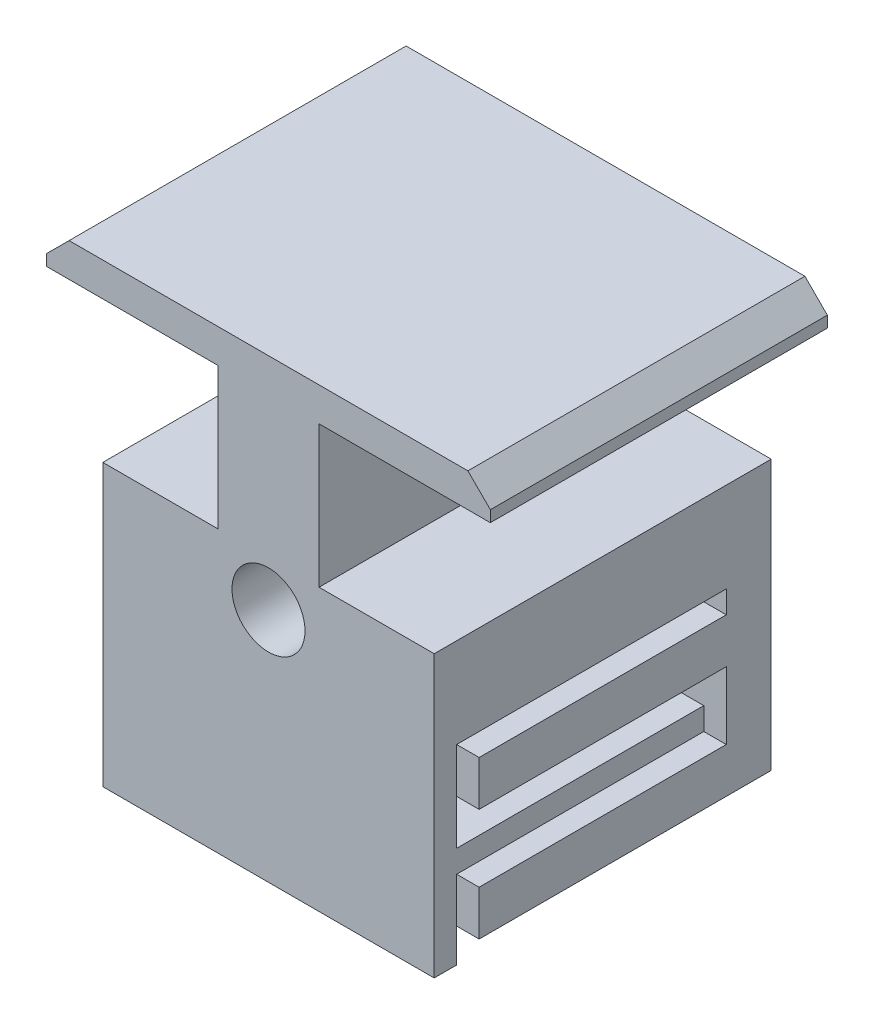
ISO-10303-21;
HEADER;
FILE_DESCRIPTION(('STEP AP214'),'2;1');
FILE_NAME('part.step','',(''),(''),'','','');
FILE_SCHEMA(('AUTOMOTIVE_DESIGN { 1 0 10303 214 1 1 1 1 }'));
ENDSEC;
DATA;
#1=APPLICATION_CONTEXT('core data for automotive mechanical design processes');
#2=APPLICATION_PROTOCOL_DEFINITION('international standard','automotive_design',2000,#1);
#3=PRODUCT_CONTEXT('',#1,'mechanical');
#4=PRODUCT('Part','Part','',(#3));
#5=PRODUCT_RELATED_PRODUCT_CATEGORY('part','',(#4));
#6=PRODUCT_DEFINITION_FORMATION('','',#4);
#7=PRODUCT_DEFINITION_CONTEXT('part definition',#1,'design');
#8=PRODUCT_DEFINITION('design','',#6,#7);
#9=PRODUCT_DEFINITION_SHAPE('','',#8);
#10=(LENGTH_UNIT() NAMED_UNIT(*) SI_UNIT(.MILLI.,.METRE.));
#11=(NAMED_UNIT(*) PLANE_ANGLE_UNIT() SI_UNIT($,.RADIAN.));
#12=(NAMED_UNIT(*) SI_UNIT($,.STERADIAN.) SOLID_ANGLE_UNIT());
#13=UNCERTAINTY_MEASURE_WITH_UNIT(LENGTH_MEASURE(1.E-05),#10,'distance_accuracy_value','');
#14=(GEOMETRIC_REPRESENTATION_CONTEXT(3) GLOBAL_UNCERTAINTY_ASSIGNED_CONTEXT((#13)) GLOBAL_UNIT_ASSIGNED_CONTEXT((#10,
#11,#12)) REPRESENTATION_CONTEXT('',''));
#15=CARTESIAN_POINT('',(0.,0.,0.));
#16=DIRECTION('',(0.,0.,1.));
#17=DIRECTION('',(1.,0.,0.));
#18=AXIS2_PLACEMENT_3D('',#15,#16,#17);
#19=CARTESIAN_POINT('',(19.25,-40.6,30.));
#20=DIRECTION('',(0.,1.,0.));
#21=DIRECTION('',(0.,0.,1.));
#22=AXIS2_PLACEMENT_3D('',#19,#20,#21);
#23=PLANE('',#22);
#24=DIRECTION('',(-1.,0.,0.));
#25=VECTOR('',#24,1.);
#26=CARTESIAN_POINT('',(19.25,-40.6,28.));
#27=LINE('',#26,#25);
#28=CARTESIAN_POINT('',(19.25,-40.6,28.));
#29=VERTEX_POINT('',#28);
#30=CARTESIAN_POINT('',(0.,-40.6,28.));
#31=VERTEX_POINT('',#30);
#32=EDGE_CURVE('E325',#29,#31,#27,.T.);
#33=ORIENTED_EDGE('',*,*,#32,.F.);
#34=DIRECTION('',(0.,0.,-1.));
#35=VECTOR('',#34,1.);
#36=CARTESIAN_POINT('',(19.25,-40.6,30.));
#37=LINE('',#36,#35);
#38=CARTESIAN_POINT('',(19.25,-40.6,30.));
#39=VERTEX_POINT('',#38);
#40=EDGE_CURVE('E394',#39,#29,#37,.T.);
#41=ORIENTED_EDGE('',*,*,#40,.F.);
#42=DIRECTION('',(1.,0.,0.));
#43=VECTOR('',#42,1.);
#44=CARTESIAN_POINT('',(19.25,-40.6,30.));
#45=LINE('',#44,#43);
#46=CARTESIAN_POINT('',(-10.25,-40.6,30.));
#47=VERTEX_POINT('',#46);
#48=EDGE_CURVE('E344',#47,#39,#45,.T.);
#49=ORIENTED_EDGE('',*,*,#48,.F.);
#50=DIRECTION('',(0.,0.,-1.));
#51=VECTOR('',#50,1.);
#52=CARTESIAN_POINT('',(-10.25,-40.6,30.));
#53=LINE('',#52,#51);
#54=CARTESIAN_POINT('',(-10.25,-40.6,0.));
#55=VERTEX_POINT('',#54);
#56=EDGE_CURVE('E397',#47,#55,#53,.T.);
#57=ORIENTED_EDGE('',*,*,#56,.T.);
#58=DIRECTION('',(1.,0.,0.));
#59=VECTOR('',#58,1.);
#60=CARTESIAN_POINT('',(19.25,-40.6,0.));
#61=LINE('',#60,#59);
#62=CARTESIAN_POINT('',(0.,-40.6,0.));
#63=VERTEX_POINT('',#62);
#64=EDGE_CURVE('E367',#55,#63,#61,.T.);
#65=ORIENTED_EDGE('',*,*,#64,.T.);
#66=DIRECTION('',(0.,0.,1.));
#67=VECTOR('',#66,1.);
#68=CARTESIAN_POINT('',(0.,-40.6,30.));
#69=LINE('',#68,#67);
#70=EDGE_CURVE('E286',#63,#31,#69,.T.);
#71=ORIENTED_EDGE('',*,*,#70,.T.);
#72=EDGE_LOOP('',(#33,#41,#49,#57,#65,#71));
#73=FACE_BOUND('',#72,.T.);
#74=ADVANCED_FACE('F33',(#73),#23,.F.);
#75=CARTESIAN_POINT('',(-15.25,0.,30.));
#76=DIRECTION('',(1.,0.,0.));
#77=DIRECTION('',(0.,0.,-1.));
#78=AXIS2_PLACEMENT_3D('',#75,#76,#77);
#79=PLANE('',#78);
#80=DIRECTION('',(0.,-1.,0.));
#81=VECTOR('',#80,1.);
#82=CARTESIAN_POINT('',(-15.25,0.,30.));
#83=LINE('',#82,#81);
#84=CARTESIAN_POINT('',(-15.25,-1.99999999999999,30.));
#85=VERTEX_POINT('',#84);
#86=CARTESIAN_POINT('',(-15.25,-3.,30.));
#87=VERTEX_POINT('',#86);
#88=EDGE_CURVE('E333',#85,#87,#83,.T.);
#89=ORIENTED_EDGE('',*,*,#88,.F.);
#90=DIRECTION('',(0.,0.,-1.));
#91=VECTOR('',#90,1.);
#92=CARTESIAN_POINT('',(-15.25,-1.99999999999999,30.));
#93=LINE('',#92,#91);
#94=CARTESIAN_POINT('',(-15.25,-1.99999999999999,0.));
#95=VERTEX_POINT('',#94);
#96=EDGE_CURVE('E11',#85,#95,#93,.T.);
#97=ORIENTED_EDGE('',*,*,#96,.T.);
#98=DIRECTION('',(0.,-1.,0.));
#99=VECTOR('',#98,1.);
#100=CARTESIAN_POINT('',(-15.25,0.,0.));
#101=LINE('',#100,#99);
#102=CARTESIAN_POINT('',(-15.25,-3.,0.));
#103=VERTEX_POINT('',#102);
#104=EDGE_CURVE('E357',#95,#103,#101,.T.);
#105=ORIENTED_EDGE('',*,*,#104,.T.);
#106=DIRECTION('',(0.,0.,-1.));
#107=VECTOR('',#106,1.);
#108=CARTESIAN_POINT('',(-15.25,-3.,30.));
#109=LINE('',#108,#107);
#110=EDGE_CURVE('E409',#87,#103,#109,.T.);
#111=ORIENTED_EDGE('',*,*,#110,.F.);
#112=EDGE_LOOP('',(#89,#97,#105,#111));
#113=FACE_BOUND('',#112,.T.);
#114=ADVANCED_FACE('F524',(#113),#79,.F.);
#115=CARTESIAN_POINT('',(-10.25,-3.,30.));
#116=DIRECTION('',(0.,1.,0.));
#117=DIRECTION('',(0.,0.,1.));
#118=AXIS2_PLACEMENT_3D('',#115,#116,#117);
#119=PLANE('',#118);
#120=DIRECTION('',(1.,0.,0.));
#121=VECTOR('',#120,1.);
#122=CARTESIAN_POINT('',(-10.25,-3.,0.));
#123=LINE('',#122,#121);
#124=CARTESIAN_POINT('',(0.,-3.,0.));
#125=VERTEX_POINT('',#124);
#126=EDGE_CURVE('E359',#103,#125,#123,.T.);
#127=ORIENTED_EDGE('',*,*,#126,.T.);
#128=DIRECTION('',(0.,0.,-1.));
#129=VECTOR('',#128,1.);
#130=CARTESIAN_POINT('',(0.,-3.,30.));
#131=LINE('',#130,#129);
#132=CARTESIAN_POINT('',(0.,-3.,30.));
#133=VERTEX_POINT('',#132);
#134=EDGE_CURVE('E406',#133,#125,#131,.T.);
#135=ORIENTED_EDGE('',*,*,#134,.F.);
#136=DIRECTION('',(1.,0.,0.));
#137=VECTOR('',#136,1.);
#138=CARTESIAN_POINT('',(-15.25,-3.,30.));
#139=LINE('',#138,#137);
#140=EDGE_CURVE('E336',#87,#133,#139,.T.);
#141=ORIENTED_EDGE('',*,*,#140,.F.);
#142=ORIENTED_EDGE('',*,*,#110,.T.);
#143=EDGE_LOOP('',(#127,#135,#141,#142));
#144=FACE_BOUND('',#143,.T.);
#145=ADVANCED_FACE('F520',(#144),#119,.F.);
#146=CARTESIAN_POINT('',(0.,-3.,30.));
#147=DIRECTION('',(1.,0.,0.));
#148=DIRECTION('',(0.,1.,0.));
#149=AXIS2_PLACEMENT_3D('',#146,#147,#148);
#150=PLANE('',#149);
#151=DIRECTION('',(0.,-1.,0.));
#152=VECTOR('',#151,1.);
#153=CARTESIAN_POINT('',(0.,-3.,0.));
#154=LINE('',#153,#152);
#155=CARTESIAN_POINT('',(0.,-15.6,0.));
#156=VERTEX_POINT('',#155);
#157=EDGE_CURVE('E361',#125,#156,#154,.T.);
#158=ORIENTED_EDGE('',*,*,#157,.T.);
#159=DIRECTION('',(0.,0.,-1.));
#160=VECTOR('',#159,1.);
#161=CARTESIAN_POINT('',(0.,-15.6,30.));
#162=LINE('',#161,#160);
#163=CARTESIAN_POINT('',(0.,-15.6,30.));
#164=VERTEX_POINT('',#163);
#165=EDGE_CURVE('E403',#164,#156,#162,.T.);
#166=ORIENTED_EDGE('',*,*,#165,.F.);
#167=DIRECTION('',(0.,-1.,0.));
#168=VECTOR('',#167,1.);
#169=CARTESIAN_POINT('',(0.,-3.,30.));
#170=LINE('',#169,#168);
#171=EDGE_CURVE('E338',#133,#164,#170,.T.);
#172=ORIENTED_EDGE('',*,*,#171,.F.);
#173=ORIENTED_EDGE('',*,*,#134,.T.);
#174=EDGE_LOOP('',(#158,#166,#172,#173));
#175=FACE_BOUND('',#174,.T.);
#176=ADVANCED_FACE('F516',(#175),#150,.F.);
#177=CARTESIAN_POINT('',(0.,-15.6,30.));
#178=DIRECTION('',(0.,-1.,0.));
#179=DIRECTION('',(1.,0.,0.));
#180=AXIS2_PLACEMENT_3D('',#177,#178,#179);
#181=PLANE('',#180);
#182=DIRECTION('',(-1.,0.,0.));
#183=VECTOR('',#182,1.);
#184=CARTESIAN_POINT('',(0.,-15.6,0.));
#185=LINE('',#184,#183);
#186=CARTESIAN_POINT('',(-10.25,-15.6,0.));
#187=VERTEX_POINT('',#186);
#188=EDGE_CURVE('E363',#156,#187,#185,.T.);
#189=ORIENTED_EDGE('',*,*,#188,.T.);
#190=DIRECTION('',(0.,0.,-1.));
#191=VECTOR('',#190,1.);
#192=CARTESIAN_POINT('',(-10.25,-15.6,30.));
#193=LINE('',#192,#191);
#194=CARTESIAN_POINT('',(-10.25,-15.6,30.));
#195=VERTEX_POINT('',#194);
#196=EDGE_CURVE('E400',#195,#187,#193,.T.);
#197=ORIENTED_EDGE('',*,*,#196,.F.);
#198=DIRECTION('',(-1.,0.,0.));
#199=VECTOR('',#198,1.);
#200=CARTESIAN_POINT('',(0.,-15.6,30.));
#201=LINE('',#200,#199);
#202=EDGE_CURVE('E340',#164,#195,#201,.T.);
#203=ORIENTED_EDGE('',*,*,#202,.F.);
#204=ORIENTED_EDGE('',*,*,#165,.T.);
#205=EDGE_LOOP('',(#189,#197,#203,#204));
#206=FACE_BOUND('',#205,.T.);
#207=ADVANCED_FACE('F511',(#206),#181,.F.);
#208=CARTESIAN_POINT('',(-10.25,-15.6,30.));
#209=DIRECTION('',(1.,0.,0.));
#210=DIRECTION('',(0.,1.,0.));
#211=AXIS2_PLACEMENT_3D('',#208,#209,#210);
#212=PLANE('',#211);
#213=DIRECTION('',(0.,-1.,0.));
#214=VECTOR('',#213,1.);
#215=CARTESIAN_POINT('',(-10.25,-15.6,0.));
#216=LINE('',#215,#214);
#217=EDGE_CURVE('E365',#187,#55,#216,.T.);
#218=ORIENTED_EDGE('',*,*,#217,.T.);
#219=ORIENTED_EDGE('',*,*,#56,.F.);
#220=DIRECTION('',(0.,-1.,0.));
#221=VECTOR('',#220,1.);
#222=CARTESIAN_POINT('',(-10.25,-15.6,30.));
#223=LINE('',#222,#221);
#224=EDGE_CURVE('E342',#195,#47,#223,.T.);
#225=ORIENTED_EDGE('',*,*,#224,.F.);
#226=ORIENTED_EDGE('',*,*,#196,.T.);
#227=EDGE_LOOP('',(#218,#219,#225,#226));
#228=FACE_BOUND('',#227,.T.);
#229=ADVANCED_FACE('F505',(#228),#212,.F.);
#230=CARTESIAN_POINT('',(19.25,-15.6,30.));
#231=DIRECTION('',(-1.,0.,0.));
#232=DIRECTION('',(0.,-1.,0.));
#233=AXIS2_PLACEMENT_3D('',#230,#231,#232);
#234=PLANE('',#233);
#235=DIRECTION('',(0.,-1.,0.));
#236=VECTOR('',#235,1.);
#237=CARTESIAN_POINT('',(19.25,-15.6,26.));
#238=LINE('',#237,#236);
#239=CARTESIAN_POINT('',(19.25,-35.6,26.));
#240=VERTEX_POINT('',#239);
#241=CARTESIAN_POINT('',(19.25,-39.6,26.));
#242=VERTEX_POINT('',#241);
#243=EDGE_CURVE('E441',#240,#242,#238,.T.);
#244=ORIENTED_EDGE('',*,*,#243,.T.);
#245=DIRECTION('',(0.,0.,-1.));
#246=VECTOR('',#245,1.);
#247=CARTESIAN_POINT('',(19.25,-39.6,30.));
#248=LINE('',#247,#246);
#249=CARTESIAN_POINT('',(19.25,-39.6,0.));
#250=VERTEX_POINT('',#249);
#251=EDGE_CURVE('E322',#242,#250,#248,.T.);
#252=ORIENTED_EDGE('',*,*,#251,.T.);
#253=DIRECTION('',(0.,1.,0.));
#254=VECTOR('',#253,1.);
#255=CARTESIAN_POINT('',(19.25,-15.6,0.));
#256=LINE('',#255,#254);
#257=CARTESIAN_POINT('',(19.25,-15.6,0.));
#258=VERTEX_POINT('',#257);
#259=EDGE_CURVE('E370',#250,#258,#256,.T.);
#260=ORIENTED_EDGE('',*,*,#259,.T.);
#261=DIRECTION('',(0.,0.,-1.));
#262=VECTOR('',#261,1.);
#263=CARTESIAN_POINT('',(19.25,-15.6,30.));
#264=LINE('',#263,#262);
#265=CARTESIAN_POINT('',(19.25,-15.6,30.));
#266=VERTEX_POINT('',#265);
#267=EDGE_CURVE('E391',#266,#258,#264,.T.);
#268=ORIENTED_EDGE('',*,*,#267,.F.);
#269=DIRECTION('',(0.,1.,0.));
#270=VECTOR('',#269,1.);
#271=CARTESIAN_POINT('',(19.25,-15.6,30.));
#272=LINE('',#271,#270);
#273=EDGE_CURVE('E346',#39,#266,#272,.T.);
#274=ORIENTED_EDGE('',*,*,#273,.F.);
#275=ORIENTED_EDGE('',*,*,#40,.T.);
#276=DIRECTION('',(0.,-1.,0.));
#277=VECTOR('',#276,1.);
#278=CARTESIAN_POINT('',(19.25,-15.6,28.));
#279=LINE('',#278,#277);
#280=CARTESIAN_POINT('',(19.25,-33.6,28.));
#281=VERTEX_POINT('',#280);
#282=EDGE_CURVE('E426',#281,#29,#279,.T.);
#283=ORIENTED_EDGE('',*,*,#282,.F.);
#284=DIRECTION('',(0.,0.,1.));
#285=VECTOR('',#284,1.);
#286=CARTESIAN_POINT('',(19.25,-33.6,30.));
#287=LINE('',#286,#285);
#288=CARTESIAN_POINT('',(19.25,-33.6,6.));
#289=VERTEX_POINT('',#288);
#290=EDGE_CURVE('E424',#289,#281,#287,.T.);
#291=ORIENTED_EDGE('',*,*,#290,.F.);
#292=DIRECTION('',(0.,-1.,0.));
#293=VECTOR('',#292,1.);
#294=CARTESIAN_POINT('',(19.25,-15.6,6.));
#295=LINE('',#294,#293);
#296=CARTESIAN_POINT('',(19.25,-31.6,6.));
#297=VERTEX_POINT('',#296);
#298=EDGE_CURVE('E422',#297,#289,#295,.T.);
#299=ORIENTED_EDGE('',*,*,#298,.F.);
#300=DIRECTION('',(0.,0.,-1.));
#301=VECTOR('',#300,1.);
#302=CARTESIAN_POINT('',(19.25,-31.6,30.));
#303=LINE('',#302,#301);
#304=CARTESIAN_POINT('',(19.25,-31.6,28.));
#305=VERTEX_POINT('',#304);
#306=EDGE_CURVE('E420',#305,#297,#303,.T.);
#307=ORIENTED_EDGE('',*,*,#306,.F.);
#308=DIRECTION('',(0.,-1.,0.));
#309=VECTOR('',#308,1.);
#310=CARTESIAN_POINT('',(19.25,-15.6,28.));
#311=LINE('',#310,#309);
#312=CARTESIAN_POINT('',(19.25,-23.6,28.));
#313=VERTEX_POINT('',#312);
#314=EDGE_CURVE('E418',#313,#305,#311,.T.);
#315=ORIENTED_EDGE('',*,*,#314,.F.);
#316=DIRECTION('',(0.,0.,1.));
#317=VECTOR('',#316,1.);
#318=CARTESIAN_POINT('',(19.25,-23.6,30.));
#319=LINE('',#318,#317);
#320=CARTESIAN_POINT('',(19.25,-23.6,4.));
#321=VERTEX_POINT('',#320);
#322=EDGE_CURVE('E416',#321,#313,#319,.T.);
#323=ORIENTED_EDGE('',*,*,#322,.F.);
#324=DIRECTION('',(0.,1.,0.));
#325=VECTOR('',#324,1.);
#326=CARTESIAN_POINT('',(19.25,-15.6,4.));
#327=LINE('',#326,#325);
#328=CARTESIAN_POINT('',(19.25,-25.6,4.));
#329=VERTEX_POINT('',#328);
#330=EDGE_CURVE('E412',#329,#321,#327,.T.);
#331=ORIENTED_EDGE('',*,*,#330,.F.);
#332=DIRECTION('',(0.,0.,1.));
#333=VECTOR('',#332,1.);
#334=CARTESIAN_POINT('',(19.25,-25.6,30.));
#335=LINE('',#334,#333);
#336=CARTESIAN_POINT('',(19.25,-25.6,26.));
#337=VERTEX_POINT('',#336);
#338=EDGE_CURVE('E247',#329,#337,#335,.T.);
#339=ORIENTED_EDGE('',*,*,#338,.T.);
#340=DIRECTION('',(0.,-1.,0.));
#341=VECTOR('',#340,1.);
#342=CARTESIAN_POINT('',(19.25,-15.6,26.));
#343=LINE('',#342,#341);
#344=CARTESIAN_POINT('',(19.25,-29.6,26.));
#345=VERTEX_POINT('',#344);
#346=EDGE_CURVE('E429',#337,#345,#343,.T.);
#347=ORIENTED_EDGE('',*,*,#346,.T.);
#348=DIRECTION('',(0.,0.,-1.));
#349=VECTOR('',#348,1.);
#350=CARTESIAN_POINT('',(19.25,-29.6,30.));
#351=LINE('',#350,#349);
#352=CARTESIAN_POINT('',(19.25,-29.6,4.));
#353=VERTEX_POINT('',#352);
#354=EDGE_CURVE('E432',#345,#353,#351,.T.);
#355=ORIENTED_EDGE('',*,*,#354,.T.);
#356=DIRECTION('',(0.,-1.,0.));
#357=VECTOR('',#356,1.);
#358=CARTESIAN_POINT('',(19.25,-15.6,4.));
#359=LINE('',#358,#357);
#360=CARTESIAN_POINT('',(19.25,-35.6,4.));
#361=VERTEX_POINT('',#360);
#362=EDGE_CURVE('E435',#353,#361,#359,.T.);
#363=ORIENTED_EDGE('',*,*,#362,.T.);
#364=DIRECTION('',(0.,0.,1.));
#365=VECTOR('',#364,1.);
#366=CARTESIAN_POINT('',(19.25,-35.6,30.));
#367=LINE('',#366,#365);
#368=EDGE_CURVE('E438',#361,#240,#367,.T.);
#369=ORIENTED_EDGE('',*,*,#368,.T.);
#370=EDGE_LOOP('',(#244,#252,#260,#268,#274,#275,#283,#291,#299,#307,#315,#323,#331,#339,#347,
#355,#363,#369));
#371=FACE_BOUND('',#370,.T.);
#372=ADVANCED_FACE('F486',(#371),#234,.F.);
#373=CARTESIAN_POINT('',(9.00000000000001,-15.6,30.));
#374=DIRECTION('',(0.,-1.,0.));
#375=DIRECTION('',(1.,0.,0.));
#376=AXIS2_PLACEMENT_3D('',#373,#374,#375);
#377=PLANE('',#376);
#378=DIRECTION('',(-1.,0.,0.));
#379=VECTOR('',#378,1.);
#380=CARTESIAN_POINT('',(9.00000000000001,-15.6,0.));
#381=LINE('',#380,#379);
#382=CARTESIAN_POINT('',(9.00000000000001,-15.6,0.));
#383=VERTEX_POINT('',#382);
#384=EDGE_CURVE('E372',#258,#383,#381,.T.);
#385=ORIENTED_EDGE('',*,*,#384,.T.);
#386=DIRECTION('',(0.,0.,-1.));
#387=VECTOR('',#386,1.);
#388=CARTESIAN_POINT('',(9.00000000000001,-15.6,30.));
#389=LINE('',#388,#387);
#390=CARTESIAN_POINT('',(9.00000000000001,-15.6,30.));
#391=VERTEX_POINT('',#390);
#392=EDGE_CURVE('E388',#391,#383,#389,.T.);
#393=ORIENTED_EDGE('',*,*,#392,.F.);
#394=DIRECTION('',(-1.,0.,0.));
#395=VECTOR('',#394,1.);
#396=CARTESIAN_POINT('',(9.00000000000001,-15.6,30.));
#397=LINE('',#396,#395);
#398=EDGE_CURVE('E348',#266,#391,#397,.T.);
#399=ORIENTED_EDGE('',*,*,#398,.F.);
#400=ORIENTED_EDGE('',*,*,#267,.T.);
#401=EDGE_LOOP('',(#385,#393,#399,#400));
#402=FACE_BOUND('',#401,.T.);
#403=ADVANCED_FACE('F481',(#402),#377,.F.);
#404=CARTESIAN_POINT('',(9.00000000000001,-3.00000000000003,30.));
#405=DIRECTION('',(-1.,0.,0.));
#406=DIRECTION('',(0.,-1.,0.));
#407=AXIS2_PLACEMENT_3D('',#404,#405,#406);
#408=PLANE('',#407);
#409=DIRECTION('',(0.,1.,0.));
#410=VECTOR('',#409,1.);
#411=CARTESIAN_POINT('',(9.00000000000001,-3.00000000000003,0.));
#412=LINE('',#411,#410);
#413=CARTESIAN_POINT('',(9.00000000000001,-3.00000000000003,0.));
#414=VERTEX_POINT('',#413);
#415=EDGE_CURVE('E374',#383,#414,#412,.T.);
#416=ORIENTED_EDGE('',*,*,#415,.T.);
#417=DIRECTION('',(0.,0.,-1.));
#418=VECTOR('',#417,1.);
#419=CARTESIAN_POINT('',(9.00000000000001,-3.00000000000003,30.));
#420=LINE('',#419,#418);
#421=CARTESIAN_POINT('',(9.00000000000001,-3.00000000000003,30.));
#422=VERTEX_POINT('',#421);
#423=EDGE_CURVE('E385',#422,#414,#420,.T.);
#424=ORIENTED_EDGE('',*,*,#423,.F.);
#425=DIRECTION('',(0.,1.,0.));
#426=VECTOR('',#425,1.);
#427=CARTESIAN_POINT('',(9.00000000000001,-3.00000000000003,30.));
#428=LINE('',#427,#426);
#429=EDGE_CURVE('E350',#391,#422,#428,.T.);
#430=ORIENTED_EDGE('',*,*,#429,.F.);
#431=ORIENTED_EDGE('',*,*,#392,.T.);
#432=EDGE_LOOP('',(#416,#424,#430,#431));
#433=FACE_BOUND('',#432,.T.);
#434=ADVANCED_FACE('F476',(#433),#408,.F.);
#435=CARTESIAN_POINT('',(19.25,-3.,30.));
#436=DIRECTION('',(0.,1.,0.));
#437=DIRECTION('',(0.,0.,1.));
#438=AXIS2_PLACEMENT_3D('',#435,#436,#437);
#439=PLANE('',#438);
#440=DIRECTION('',(1.,0.,0.));
#441=VECTOR('',#440,1.);
#442=CARTESIAN_POINT('',(19.25,-3.,0.));
#443=LINE('',#442,#441);
#444=CARTESIAN_POINT('',(24.25,-3.,0.));
#445=VERTEX_POINT('',#444);
#446=EDGE_CURVE('E377',#414,#445,#443,.T.);
#447=ORIENTED_EDGE('',*,*,#446,.T.);
#448=DIRECTION('',(0.,0.,-1.));
#449=VECTOR('',#448,1.);
#450=CARTESIAN_POINT('',(24.25,-3.,30.));
#451=LINE('',#450,#449);
#452=CARTESIAN_POINT('',(24.25,-3.,30.));
#453=VERTEX_POINT('',#452);
#454=EDGE_CURVE('E356',#453,#445,#451,.T.);
#455=ORIENTED_EDGE('',*,*,#454,.F.);
#456=DIRECTION('',(1.,0.,0.));
#457=VECTOR('',#456,1.);
#458=CARTESIAN_POINT('',(19.25,-3.,30.));
#459=LINE('',#458,#457);
#460=EDGE_CURVE('E352',#422,#453,#459,.T.);
#461=ORIENTED_EDGE('',*,*,#460,.F.);
#462=ORIENTED_EDGE('',*,*,#423,.T.);
#463=EDGE_LOOP('',(#447,#455,#461,#462));
#464=FACE_BOUND('',#463,.T.);
#465=ADVANCED_FACE('F471',(#464),#439,.F.);
#466=CARTESIAN_POINT('',(24.25,-3.,30.));
#467=DIRECTION('',(-1.,0.,0.));
#468=DIRECTION('',(0.,0.,1.));
#469=AXIS2_PLACEMENT_3D('',#466,#467,#468);
#470=PLANE('',#469);
#471=DIRECTION('',(0.,1.,0.));
#472=VECTOR('',#471,1.);
#473=CARTESIAN_POINT('',(24.25,-3.,0.));
#474=LINE('',#473,#472);
#475=CARTESIAN_POINT('',(24.25,-2.00000000000001,0.));
#476=VERTEX_POINT('',#475);
#477=EDGE_CURVE('E379',#445,#476,#474,.T.);
#478=ORIENTED_EDGE('',*,*,#477,.T.);
#479=DIRECTION('',(0.,0.,1.));
#480=VECTOR('',#479,1.);
#481=CARTESIAN_POINT('',(24.25,-2.00000000000001,30.));
#482=LINE('',#481,#480);
#483=CARTESIAN_POINT('',(24.25,-2.00000000000001,30.));
#484=VERTEX_POINT('',#483);
#485=EDGE_CURVE('E56',#476,#484,#482,.T.);
#486=ORIENTED_EDGE('',*,*,#485,.T.);
#487=DIRECTION('',(0.,1.,0.));
#488=VECTOR('',#487,1.);
#489=CARTESIAN_POINT('',(24.25,-3.,30.));
#490=LINE('',#489,#488);
#491=EDGE_CURVE('E354',#453,#484,#490,.T.);
#492=ORIENTED_EDGE('',*,*,#491,.F.);
#493=ORIENTED_EDGE('',*,*,#454,.T.);
#494=EDGE_LOOP('',(#478,#486,#492,#493));
#495=FACE_BOUND('',#494,.T.);
#496=ADVANCED_FACE('F467',(#495),#470,.F.);
#497=CARTESIAN_POINT('',(9.00000000000001,0.,30.));
#498=DIRECTION('',(0.,-1.,0.));
#499=DIRECTION('',(1.,0.,0.));
#500=AXIS2_PLACEMENT_3D('',#497,#498,#499);
#501=PLANE('',#500);
#502=DIRECTION('',(-1.,0.,0.));
#503=VECTOR('',#502,1.);
#504=CARTESIAN_POINT('',(0.,0.,30.));
#505=LINE('',#504,#503);
#506=CARTESIAN_POINT('',(22.25,0.,30.));
#507=VERTEX_POINT('',#506);
#508=CARTESIAN_POINT('',(-13.2500000000001,0.,30.));
#509=VERTEX_POINT('',#508);
#510=EDGE_CURVE('E331',#507,#509,#505,.T.);
#511=ORIENTED_EDGE('',*,*,#510,.F.);
#512=DIRECTION('',(0.,0.,-1.));
#513=VECTOR('',#512,1.);
#514=CARTESIAN_POINT('',(22.25,0.,30.));
#515=LINE('',#514,#513);
#516=CARTESIAN_POINT('',(22.25,0.,0.));
#517=VERTEX_POINT('',#516);
#518=EDGE_CURVE('E446',#507,#517,#515,.T.);
#519=ORIENTED_EDGE('',*,*,#518,.T.);
#520=DIRECTION('',(-1.,0.,0.));
#521=VECTOR('',#520,1.);
#522=CARTESIAN_POINT('',(9.00000000000001,0.,0.));
#523=LINE('',#522,#521);
#524=CARTESIAN_POINT('',(-13.2500000000001,0.,0.));
#525=VERTEX_POINT('',#524);
#526=EDGE_CURVE('E334',#517,#525,#523,.T.);
#527=ORIENTED_EDGE('',*,*,#526,.T.);
#528=DIRECTION('',(0.,0.,1.));
#529=VECTOR('',#528,1.);
#530=CARTESIAN_POINT('',(-13.2500000000001,0.,30.));
#531=LINE('',#530,#529);
#532=EDGE_CURVE('E444',#525,#509,#531,.T.);
#533=ORIENTED_EDGE('',*,*,#532,.T.);
#534=EDGE_LOOP('',(#511,#519,#527,#533));
#535=FACE_BOUND('',#534,.T.);
#536=ADVANCED_FACE('F460',(#535),#501,.F.);
#537=CARTESIAN_POINT('',(0.,0.,30.));
#538=DIRECTION('',(0.,0.,1.));
#539=DIRECTION('',(1.,0.,0.));
#540=AXIS2_PLACEMENT_3D('',#537,#538,#539);
#541=PLANE('',#540);
#542=CARTESIAN_POINT('',(4.5,-19.6,30.));
#543=DIRECTION('',(0.,0.,1.));
#544=DIRECTION('',(1.,0.,0.));
#545=AXIS2_PLACEMENT_3D('',#542,#543,#544);
#546=CIRCLE('',#545,3.25);
#547=CARTESIAN_POINT('',(7.75,-19.6,30.));
#548=VERTEX_POINT('',#547);
#549=EDGE_CURVE('E327',#548,#548,#546,.T.);
#550=ORIENTED_EDGE('',*,*,#549,.F.);
#551=EDGE_LOOP('',(#550));
#552=FACE_BOUND('',#551,.T.);
#553=ORIENTED_EDGE('',*,*,#491,.T.);
#554=DIRECTION('',(0.707106781186546,-0.707106781186549,0.));
#555=VECTOR('',#554,1.);
#556=CARTESIAN_POINT('',(11.125,11.125,30.));
#557=LINE('',#556,#555);
#558=EDGE_CURVE('E41',#484,#507,#557,.F.);
#559=ORIENTED_EDGE('',*,*,#558,.T.);
#560=ORIENTED_EDGE('',*,*,#510,.T.);
#561=DIRECTION('',(0.707106781186546,0.707106781186549,0.));
#562=VECTOR('',#561,1.);
#563=CARTESIAN_POINT('',(-6.62500000000004,6.62500000000001,30.));
#564=LINE('',#563,#562);
#565=EDGE_CURVE('E48',#509,#85,#564,.F.);
#566=ORIENTED_EDGE('',*,*,#565,.T.);
#567=ORIENTED_EDGE('',*,*,#88,.T.);
#568=ORIENTED_EDGE('',*,*,#140,.T.);
#569=ORIENTED_EDGE('',*,*,#171,.T.);
#570=ORIENTED_EDGE('',*,*,#202,.T.);
#571=ORIENTED_EDGE('',*,*,#224,.T.);
#572=ORIENTED_EDGE('',*,*,#48,.T.);
#573=ORIENTED_EDGE('',*,*,#273,.T.);
#574=ORIENTED_EDGE('',*,*,#398,.T.);
#575=ORIENTED_EDGE('',*,*,#429,.T.);
#576=ORIENTED_EDGE('',*,*,#460,.T.);
#577=EDGE_LOOP('',(#553,#559,#560,#566,#567,#568,#569,#570,#571,#572,#573,#574,#575,#576));
#578=FACE_BOUND('',#577,.T.);
#579=ADVANCED_FACE('F456',(#552,#578),#541,.T.);
#580=CARTESIAN_POINT('',(0.,0.,0.));
#581=DIRECTION('',(0.,0.,1.));
#582=DIRECTION('',(1.,0.,0.));
#583=AXIS2_PLACEMENT_3D('',#580,#581,#582);
#584=PLANE('',#583);
#585=CARTESIAN_POINT('',(4.5,-19.6,0.));
#586=DIRECTION('',(0.,0.,1.));
#587=DIRECTION('',(1.,0.,0.));
#588=AXIS2_PLACEMENT_3D('',#585,#586,#587);
#589=CIRCLE('',#588,3.25);
#590=CARTESIAN_POINT('',(7.75,-19.6,0.));
#591=VERTEX_POINT('',#590);
#592=EDGE_CURVE('E330',#591,#591,#589,.T.);
#593=ORIENTED_EDGE('',*,*,#592,.T.);
#594=EDGE_LOOP('',(#593));
#595=FACE_BOUND('',#594,.T.);
#596=ORIENTED_EDGE('',*,*,#526,.F.);
#597=DIRECTION('',(-0.707106781186546,0.707106781186549,0.));
#598=VECTOR('',#597,1.);
#599=CARTESIAN_POINT('',(22.25,0.,0.));
#600=LINE('',#599,#598);
#601=EDGE_CURVE('E451',#517,#476,#600,.F.);
#602=ORIENTED_EDGE('',*,*,#601,.T.);
#603=ORIENTED_EDGE('',*,*,#477,.F.);
#604=ORIENTED_EDGE('',*,*,#446,.F.);
#605=ORIENTED_EDGE('',*,*,#415,.F.);
#606=ORIENTED_EDGE('',*,*,#384,.F.);
#607=ORIENTED_EDGE('',*,*,#259,.F.);
#608=DIRECTION('',(1.,0.,0.));
#609=VECTOR('',#608,1.);
#610=CARTESIAN_POINT('',(0.,-39.6,0.));
#611=LINE('',#610,#609);
#612=CARTESIAN_POINT('',(0.,-39.6,0.));
#613=VERTEX_POINT('',#612);
#614=EDGE_CURVE('E302',#613,#250,#611,.T.);
#615=ORIENTED_EDGE('',*,*,#614,.F.);
#616=DIRECTION('',(0.,-1.,0.));
#617=VECTOR('',#616,1.);
#618=CARTESIAN_POINT('',(0.,-39.6,0.));
#619=LINE('',#618,#617);
#620=EDGE_CURVE('E266',#613,#63,#619,.T.);
#621=ORIENTED_EDGE('',*,*,#620,.T.);
#622=ORIENTED_EDGE('',*,*,#64,.F.);
#623=ORIENTED_EDGE('',*,*,#217,.F.);
#624=ORIENTED_EDGE('',*,*,#188,.F.);
#625=ORIENTED_EDGE('',*,*,#157,.F.);
#626=ORIENTED_EDGE('',*,*,#126,.F.);
#627=ORIENTED_EDGE('',*,*,#104,.F.);
#628=DIRECTION('',(-0.707106781186546,-0.707106781186549,0.));
#629=VECTOR('',#628,1.);
#630=CARTESIAN_POINT('',(-15.25,-1.99999999999999,0.));
#631=LINE('',#630,#629);
#632=EDGE_CURVE('E449',#95,#525,#631,.F.);
#633=ORIENTED_EDGE('',*,*,#632,.T.);
#634=EDGE_LOOP('',(#596,#602,#603,#604,#605,#606,#607,#615,#621,#622,#623,#624,#625,#626,#627,#633));
#635=FACE_BOUND('',#634,.T.);
#636=ADVANCED_FACE('F466',(#595,#635),#584,.F.);
#637=CARTESIAN_POINT('',(4.5,-19.6,-6.00000000000001));
#638=DIRECTION('',(0.,0.,1.));
#639=DIRECTION('',(1.,0.,0.));
#640=AXIS2_PLACEMENT_3D('',#637,#638,#639);
#641=CYLINDRICAL_SURFACE('',#640,3.25);
#642=ORIENTED_EDGE('',*,*,#549,.T.);
#643=EDGE_LOOP('',(#642));
#644=FACE_BOUND('',#643,.T.);
#645=ORIENTED_EDGE('',*,*,#592,.F.);
#646=EDGE_LOOP('',(#645));
#647=FACE_BOUND('',#646,.T.);
#648=ADVANCED_FACE('F612',(#644,#647),#641,.F.);
#649=CARTESIAN_POINT('',(0.,-25.6,26.));
#650=DIRECTION('',(0.,-1.,0.));
#651=DIRECTION('',(1.,0.,0.));
#652=AXIS2_PLACEMENT_3D('',#649,#650,#651);
#653=PLANE('',#652);
#654=DIRECTION('',(1.,0.,0.));
#655=VECTOR('',#654,1.);
#656=CARTESIAN_POINT('',(0.,-25.6,4.));
#657=LINE('',#656,#655);
#658=CARTESIAN_POINT('',(0.,-25.6,4.));
#659=VERTEX_POINT('',#658);
#660=EDGE_CURVE('E231',#659,#329,#657,.T.);
#661=ORIENTED_EDGE('',*,*,#660,.F.);
#662=DIRECTION('',(0.,0.,-1.));
#663=VECTOR('',#662,1.);
#664=CARTESIAN_POINT('',(0.,-25.6,26.));
#665=LINE('',#664,#663);
#666=CARTESIAN_POINT('',(0.,-25.6,26.));
#667=VERTEX_POINT('',#666);
#668=EDGE_CURVE('E239',#667,#659,#665,.T.);
#669=ORIENTED_EDGE('',*,*,#668,.F.);
#670=DIRECTION('',(1.,0.,0.));
#671=VECTOR('',#670,1.);
#672=CARTESIAN_POINT('',(0.,-25.6,26.));
#673=LINE('',#672,#671);
#674=EDGE_CURVE('E284',#667,#337,#673,.T.);
#675=ORIENTED_EDGE('',*,*,#674,.T.);
#676=ORIENTED_EDGE('',*,*,#338,.F.);
#677=EDGE_LOOP('',(#661,#669,#675,#676));
#678=FACE_BOUND('',#677,.T.);
#679=ADVANCED_FACE('F243',(#678),#653,.F.);
#680=CARTESIAN_POINT('',(0.,-29.6,26.));
#681=DIRECTION('',(0.,0.,-1.));
#682=DIRECTION('',(-1.,0.,0.));
#683=AXIS2_PLACEMENT_3D('',#680,#681,#682);
#684=PLANE('',#683);
#685=ORIENTED_EDGE('',*,*,#674,.F.);
#686=DIRECTION('',(0.,1.,0.));
#687=VECTOR('',#686,1.);
#688=CARTESIAN_POINT('',(0.,-29.6,26.));
#689=LINE('',#688,#687);
#690=CARTESIAN_POINT('',(0.,-29.6,26.));
#691=VERTEX_POINT('',#690);
#692=EDGE_CURVE('E248',#691,#667,#689,.T.);
#693=ORIENTED_EDGE('',*,*,#692,.F.);
#694=DIRECTION('',(1.,0.,0.));
#695=VECTOR('',#694,1.);
#696=CARTESIAN_POINT('',(0.,-29.6,26.));
#697=LINE('',#696,#695);
#698=EDGE_CURVE('E287',#691,#345,#697,.T.);
#699=ORIENTED_EDGE('',*,*,#698,.T.);
#700=ORIENTED_EDGE('',*,*,#346,.F.);
#701=EDGE_LOOP('',(#685,#693,#699,#700));
#702=FACE_BOUND('',#701,.T.);
#703=ADVANCED_FACE('F626',(#702),#684,.F.);
#704=CARTESIAN_POINT('',(0.,-29.6,4.));
#705=DIRECTION('',(0.,1.,0.));
#706=DIRECTION('',(0.,0.,1.));
#707=AXIS2_PLACEMENT_3D('',#704,#705,#706);
#708=PLANE('',#707);
#709=ORIENTED_EDGE('',*,*,#698,.F.);
#710=DIRECTION('',(0.,0.,1.));
#711=VECTOR('',#710,1.);
#712=CARTESIAN_POINT('',(0.,-29.6,4.));
#713=LINE('',#712,#711);
#714=CARTESIAN_POINT('',(0.,-29.6,4.));
#715=VERTEX_POINT('',#714);
#716=EDGE_CURVE('E281',#715,#691,#713,.T.);
#717=ORIENTED_EDGE('',*,*,#716,.F.);
#718=DIRECTION('',(1.,0.,0.));
#719=VECTOR('',#718,1.);
#720=CARTESIAN_POINT('',(0.,-29.6,4.));
#721=LINE('',#720,#719);
#722=EDGE_CURVE('E290',#715,#353,#721,.T.);
#723=ORIENTED_EDGE('',*,*,#722,.T.);
#724=ORIENTED_EDGE('',*,*,#354,.F.);
#725=EDGE_LOOP('',(#709,#717,#723,#724));
#726=FACE_BOUND('',#725,.T.);
#727=ADVANCED_FACE('F633',(#726),#708,.F.);
#728=CARTESIAN_POINT('',(0.,-35.6,4.));
#729=DIRECTION('',(0.,0.,-1.));
#730=DIRECTION('',(-1.,0.,0.));
#731=AXIS2_PLACEMENT_3D('',#728,#729,#730);
#732=PLANE('',#731);
#733=ORIENTED_EDGE('',*,*,#722,.F.);
#734=DIRECTION('',(0.,1.,0.));
#735=VECTOR('',#734,1.);
#736=CARTESIAN_POINT('',(0.,-35.6,4.));
#737=LINE('',#736,#735);
#738=CARTESIAN_POINT('',(0.,-35.6,4.));
#739=VERTEX_POINT('',#738);
#740=EDGE_CURVE('E278',#739,#715,#737,.T.);
#741=ORIENTED_EDGE('',*,*,#740,.F.);
#742=DIRECTION('',(1.,0.,0.));
#743=VECTOR('',#742,1.);
#744=CARTESIAN_POINT('',(0.,-35.6,4.));
#745=LINE('',#744,#743);
#746=EDGE_CURVE('E293',#739,#361,#745,.T.);
#747=ORIENTED_EDGE('',*,*,#746,.T.);
#748=ORIENTED_EDGE('',*,*,#362,.F.);
#749=EDGE_LOOP('',(#733,#741,#747,#748));
#750=FACE_BOUND('',#749,.T.);
#751=ADVANCED_FACE('F641',(#750),#732,.F.);
#752=CARTESIAN_POINT('',(0.,-35.6,26.));
#753=DIRECTION('',(0.,-1.,0.));
#754=DIRECTION('',(0.,0.,-1.));
#755=AXIS2_PLACEMENT_3D('',#752,#753,#754);
#756=PLANE('',#755);
#757=ORIENTED_EDGE('',*,*,#746,.F.);
#758=DIRECTION('',(0.,0.,-1.));
#759=VECTOR('',#758,1.);
#760=CARTESIAN_POINT('',(0.,-35.6,26.));
#761=LINE('',#760,#759);
#762=CARTESIAN_POINT('',(0.,-35.6,26.));
#763=VERTEX_POINT('',#762);
#764=EDGE_CURVE('E275',#763,#739,#761,.T.);
#765=ORIENTED_EDGE('',*,*,#764,.F.);
#766=DIRECTION('',(1.,0.,0.));
#767=VECTOR('',#766,1.);
#768=CARTESIAN_POINT('',(0.,-35.6,26.));
#769=LINE('',#768,#767);
#770=EDGE_CURVE('E296',#763,#240,#769,.T.);
#771=ORIENTED_EDGE('',*,*,#770,.T.);
#772=ORIENTED_EDGE('',*,*,#368,.F.);
#773=EDGE_LOOP('',(#757,#765,#771,#772));
#774=FACE_BOUND('',#773,.T.);
#775=ADVANCED_FACE('F649',(#774),#756,.F.);
#776=CARTESIAN_POINT('',(0.,-39.6,26.));
#777=DIRECTION('',(0.,0.,-1.));
#778=DIRECTION('',(-1.,0.,0.));
#779=AXIS2_PLACEMENT_3D('',#776,#777,#778);
#780=PLANE('',#779);
#781=ORIENTED_EDGE('',*,*,#770,.F.);
#782=DIRECTION('',(0.,1.,0.));
#783=VECTOR('',#782,1.);
#784=CARTESIAN_POINT('',(0.,-39.6,26.));
#785=LINE('',#784,#783);
#786=CARTESIAN_POINT('',(0.,-39.6,26.));
#787=VERTEX_POINT('',#786);
#788=EDGE_CURVE('E272',#787,#763,#785,.T.);
#789=ORIENTED_EDGE('',*,*,#788,.F.);
#790=DIRECTION('',(1.,0.,0.));
#791=VECTOR('',#790,1.);
#792=CARTESIAN_POINT('',(0.,-39.6,26.));
#793=LINE('',#792,#791);
#794=EDGE_CURVE('E299',#787,#242,#793,.T.);
#795=ORIENTED_EDGE('',*,*,#794,.T.);
#796=ORIENTED_EDGE('',*,*,#243,.F.);
#797=EDGE_LOOP('',(#781,#789,#795,#796));
#798=FACE_BOUND('',#797,.T.);
#799=ADVANCED_FACE('F493',(#798),#780,.F.);
#800=CARTESIAN_POINT('',(0.,-39.6,28.));
#801=DIRECTION('',(0.,0.,-1.));
#802=DIRECTION('',(-1.,0.,0.));
#803=AXIS2_PLACEMENT_3D('',#800,#801,#802);
#804=PLANE('',#803);
#805=ORIENTED_EDGE('',*,*,#32,.T.);
#806=DIRECTION('',(0.,1.,0.));
#807=VECTOR('',#806,1.);
#808=CARTESIAN_POINT('',(0.,-39.6,28.));
#809=LINE('',#808,#807);
#810=CARTESIAN_POINT('',(0.,-33.6,28.));
#811=VERTEX_POINT('',#810);
#812=EDGE_CURVE('E264',#31,#811,#809,.T.);
#813=ORIENTED_EDGE('',*,*,#812,.T.);
#814=DIRECTION('',(1.,0.,0.));
#815=VECTOR('',#814,1.);
#816=CARTESIAN_POINT('',(0.,-33.6,28.));
#817=LINE('',#816,#815);
#818=EDGE_CURVE('E304',#811,#281,#817,.T.);
#819=ORIENTED_EDGE('',*,*,#818,.T.);
#820=ORIENTED_EDGE('',*,*,#282,.T.);
#821=EDGE_LOOP('',(#805,#813,#819,#820));
#822=FACE_BOUND('',#821,.T.);
#823=ADVANCED_FACE('F664',(#822),#804,.T.);
#824=CARTESIAN_POINT('',(0.,-33.6,26.));
#825=DIRECTION('',(0.,-1.,0.));
#826=DIRECTION('',(0.,0.,-1.));
#827=AXIS2_PLACEMENT_3D('',#824,#825,#826);
#828=PLANE('',#827);
#829=ORIENTED_EDGE('',*,*,#290,.T.);
#830=ORIENTED_EDGE('',*,*,#818,.F.);
#831=DIRECTION('',(0.,0.,-1.));
#832=VECTOR('',#831,1.);
#833=CARTESIAN_POINT('',(0.,-33.6,26.));
#834=LINE('',#833,#832);
#835=CARTESIAN_POINT('',(0.,-33.6,6.));
#836=VERTEX_POINT('',#835);
#837=EDGE_CURVE('E262',#811,#836,#834,.T.);
#838=ORIENTED_EDGE('',*,*,#837,.T.);
#839=DIRECTION('',(1.,0.,0.));
#840=VECTOR('',#839,1.);
#841=CARTESIAN_POINT('',(0.,-33.6,6.));
#842=LINE('',#841,#840);
#843=EDGE_CURVE('E307',#836,#289,#842,.T.);
#844=ORIENTED_EDGE('',*,*,#843,.T.);
#845=EDGE_LOOP('',(#829,#830,#838,#844));
#846=FACE_BOUND('',#845,.T.);
#847=ADVANCED_FACE('F671',(#846),#828,.T.);
#848=CARTESIAN_POINT('',(0.,-35.6,6.));
#849=DIRECTION('',(0.,0.,-1.));
#850=DIRECTION('',(-1.,0.,0.));
#851=AXIS2_PLACEMENT_3D('',#848,#849,#850);
#852=PLANE('',#851);
#853=ORIENTED_EDGE('',*,*,#298,.T.);
#854=ORIENTED_EDGE('',*,*,#843,.F.);
#855=DIRECTION('',(0.,1.,0.));
#856=VECTOR('',#855,1.);
#857=CARTESIAN_POINT('',(0.,-35.6,6.));
#858=LINE('',#857,#856);
#859=CARTESIAN_POINT('',(0.,-31.6,6.));
#860=VERTEX_POINT('',#859);
#861=EDGE_CURVE('E260',#836,#860,#858,.T.);
#862=ORIENTED_EDGE('',*,*,#861,.T.);
#863=DIRECTION('',(1.,0.,0.));
#864=VECTOR('',#863,1.);
#865=CARTESIAN_POINT('',(0.,-31.6,6.));
#866=LINE('',#865,#864);
#867=EDGE_CURVE('E310',#860,#297,#866,.T.);
#868=ORIENTED_EDGE('',*,*,#867,.T.);
#869=EDGE_LOOP('',(#853,#854,#862,#868));
#870=FACE_BOUND('',#869,.T.);
#871=ADVANCED_FACE('F679',(#870),#852,.T.);
#872=CARTESIAN_POINT('',(0.,-31.6,4.));
#873=DIRECTION('',(0.,1.,0.));
#874=DIRECTION('',(0.,0.,1.));
#875=AXIS2_PLACEMENT_3D('',#872,#873,#874);
#876=PLANE('',#875);
#877=ORIENTED_EDGE('',*,*,#306,.T.);
#878=ORIENTED_EDGE('',*,*,#867,.F.);
#879=DIRECTION('',(0.,0.,1.));
#880=VECTOR('',#879,1.);
#881=CARTESIAN_POINT('',(0.,-31.6,4.));
#882=LINE('',#881,#880);
#883=CARTESIAN_POINT('',(0.,-31.6,28.));
#884=VERTEX_POINT('',#883);
#885=EDGE_CURVE('E258',#860,#884,#882,.T.);
#886=ORIENTED_EDGE('',*,*,#885,.T.);
#887=DIRECTION('',(1.,0.,0.));
#888=VECTOR('',#887,1.);
#889=CARTESIAN_POINT('',(0.,-31.6,28.));
#890=LINE('',#889,#888);
#891=EDGE_CURVE('E313',#884,#305,#890,.T.);
#892=ORIENTED_EDGE('',*,*,#891,.T.);
#893=EDGE_LOOP('',(#877,#878,#886,#892));
#894=FACE_BOUND('',#893,.T.);
#895=ADVANCED_FACE('F687',(#894),#876,.T.);
#896=CARTESIAN_POINT('',(0.,-29.6,28.));
#897=DIRECTION('',(0.,0.,-1.));
#898=DIRECTION('',(-1.,0.,0.));
#899=AXIS2_PLACEMENT_3D('',#896,#897,#898);
#900=PLANE('',#899);
#901=ORIENTED_EDGE('',*,*,#314,.T.);
#902=ORIENTED_EDGE('',*,*,#891,.F.);
#903=DIRECTION('',(0.,1.,0.));
#904=VECTOR('',#903,1.);
#905=CARTESIAN_POINT('',(0.,-29.6,28.));
#906=LINE('',#905,#904);
#907=CARTESIAN_POINT('',(0.,-23.6,28.));
#908=VERTEX_POINT('',#907);
#909=EDGE_CURVE('E256',#884,#908,#906,.T.);
#910=ORIENTED_EDGE('',*,*,#909,.T.);
#911=DIRECTION('',(1.,0.,0.));
#912=VECTOR('',#911,1.);
#913=CARTESIAN_POINT('',(0.,-23.6,28.));
#914=LINE('',#913,#912);
#915=EDGE_CURVE('E316',#908,#313,#914,.T.);
#916=ORIENTED_EDGE('',*,*,#915,.T.);
#917=EDGE_LOOP('',(#901,#902,#910,#916));
#918=FACE_BOUND('',#917,.T.);
#919=ADVANCED_FACE('F695',(#918),#900,.T.);
#920=CARTESIAN_POINT('',(0.,-23.6,26.));
#921=DIRECTION('',(0.,-1.,0.));
#922=DIRECTION('',(1.,0.,0.));
#923=AXIS2_PLACEMENT_3D('',#920,#921,#922);
#924=PLANE('',#923);
#925=ORIENTED_EDGE('',*,*,#322,.T.);
#926=ORIENTED_EDGE('',*,*,#915,.F.);
#927=DIRECTION('',(0.,0.,-1.));
#928=VECTOR('',#927,1.);
#929=CARTESIAN_POINT('',(0.,-23.6,26.));
#930=LINE('',#929,#928);
#931=CARTESIAN_POINT('',(0.,-23.6,4.));
#932=VERTEX_POINT('',#931);
#933=EDGE_CURVE('E238',#908,#932,#930,.T.);
#934=ORIENTED_EDGE('',*,*,#933,.T.);
#935=DIRECTION('',(1.,0.,0.));
#936=VECTOR('',#935,1.);
#937=CARTESIAN_POINT('',(0.,-23.6,4.));
#938=LINE('',#937,#936);
#939=EDGE_CURVE('E234',#932,#321,#938,.T.);
#940=ORIENTED_EDGE('',*,*,#939,.T.);
#941=EDGE_LOOP('',(#925,#926,#934,#940));
#942=FACE_BOUND('',#941,.T.);
#943=ADVANCED_FACE('F703',(#942),#924,.T.);
#944=CARTESIAN_POINT('',(0.,-23.6,4.));
#945=DIRECTION('',(0.,0.,1.));
#946=DIRECTION('',(1.,0.,0.));
#947=AXIS2_PLACEMENT_3D('',#944,#945,#946);
#948=PLANE('',#947);
#949=ORIENTED_EDGE('',*,*,#330,.T.);
#950=ORIENTED_EDGE('',*,*,#939,.F.);
#951=DIRECTION('',(0.,-1.,0.));
#952=VECTOR('',#951,1.);
#953=CARTESIAN_POINT('',(0.,-23.6,4.));
#954=LINE('',#953,#952);
#955=EDGE_CURVE('E228',#932,#659,#954,.T.);
#956=ORIENTED_EDGE('',*,*,#955,.T.);
#957=ORIENTED_EDGE('',*,*,#660,.T.);
#958=EDGE_LOOP('',(#949,#950,#956,#957));
#959=FACE_BOUND('',#958,.T.);
#960=ADVANCED_FACE('F230',(#959),#948,.T.);
#961=CARTESIAN_POINT('',(0.,-39.6,0.));
#962=DIRECTION('',(0.,1.,0.));
#963=DIRECTION('',(-1.,0.,0.));
#964=AXIS2_PLACEMENT_3D('',#961,#962,#963);
#965=PLANE('',#964);
#966=ORIENTED_EDGE('',*,*,#794,.F.);
#967=DIRECTION('',(0.,0.,1.));
#968=VECTOR('',#967,1.);
#969=CARTESIAN_POINT('',(0.,-39.6,0.));
#970=LINE('',#969,#968);
#971=EDGE_CURVE('E269',#613,#787,#970,.T.);
#972=ORIENTED_EDGE('',*,*,#971,.F.);
#973=ORIENTED_EDGE('',*,*,#614,.T.);
#974=ORIENTED_EDGE('',*,*,#251,.F.);
#975=EDGE_LOOP('',(#966,#972,#973,#974));
#976=FACE_BOUND('',#975,.T.);
#977=ADVANCED_FACE('F489',(#976),#965,.F.);
#978=CARTESIAN_POINT('',(0.,0.,0.));
#979=DIRECTION('',(-1.,0.,0.));
#980=DIRECTION('',(0.,0.,1.));
#981=AXIS2_PLACEMENT_3D('',#978,#979,#980);
#982=PLANE('',#981);
#983=ORIENTED_EDGE('',*,*,#620,.F.);
#984=ORIENTED_EDGE('',*,*,#971,.T.);
#985=ORIENTED_EDGE('',*,*,#788,.T.);
#986=ORIENTED_EDGE('',*,*,#764,.T.);
#987=ORIENTED_EDGE('',*,*,#740,.T.);
#988=ORIENTED_EDGE('',*,*,#716,.T.);
#989=ORIENTED_EDGE('',*,*,#692,.T.);
#990=ORIENTED_EDGE('',*,*,#668,.T.);
#991=ORIENTED_EDGE('',*,*,#955,.F.);
#992=ORIENTED_EDGE('',*,*,#933,.F.);
#993=ORIENTED_EDGE('',*,*,#909,.F.);
#994=ORIENTED_EDGE('',*,*,#885,.F.);
#995=ORIENTED_EDGE('',*,*,#861,.F.);
#996=ORIENTED_EDGE('',*,*,#837,.F.);
#997=ORIENTED_EDGE('',*,*,#812,.F.);
#998=ORIENTED_EDGE('',*,*,#70,.F.);
#999=EDGE_LOOP('',(#983,#984,#985,#986,#987,#988,#989,#990,#991,#992,#993,#994,#995,#996,#997,#998));
#1000=FACE_BOUND('',#999,.T.);
#1001=ADVANCED_FACE('F250',(#1000),#982,.F.);
#1002=CARTESIAN_POINT('',(22.25,0.,30.));
#1003=DIRECTION('',(-0.707106781186549,-0.707106781186546,0.));
#1004=DIRECTION('',(0.,0.,-1.));
#1005=AXIS2_PLACEMENT_3D('',#1002,#1003,#1004);
#1006=PLANE('',#1005);
#1007=ORIENTED_EDGE('',*,*,#558,.F.);
#1008=ORIENTED_EDGE('',*,*,#485,.F.);
#1009=ORIENTED_EDGE('',*,*,#601,.F.);
#1010=ORIENTED_EDGE('',*,*,#518,.F.);
#1011=EDGE_LOOP('',(#1007,#1008,#1009,#1010));
#1012=FACE_BOUND('',#1011,.T.);
#1013=ADVANCED_FACE('F463',(#1012),#1006,.F.);
#1014=CARTESIAN_POINT('',(-15.25,-1.99999999999999,30.));
#1015=DIRECTION('',(0.707106781186549,-0.707106781186546,0.));
#1016=DIRECTION('',(0.,0.,-1.));
#1017=AXIS2_PLACEMENT_3D('',#1014,#1015,#1016);
#1018=PLANE('',#1017);
#1019=ORIENTED_EDGE('',*,*,#565,.F.);
#1020=ORIENTED_EDGE('',*,*,#532,.F.);
#1021=ORIENTED_EDGE('',*,*,#632,.F.);
#1022=ORIENTED_EDGE('',*,*,#96,.F.);
#1023=EDGE_LOOP('',(#1019,#1020,#1021,#1022));
#1024=FACE_BOUND('',#1023,.T.);
#1025=ADVANCED_FACE('F35',(#1024),#1018,.F.);
#1026=CLOSED_SHELL('',(#74,#114,#145,#176,#207,#229,#372,#403,#434,#465,#496,#536,#579,#636,
#648,#679,#703,#727,#751,#775,#799,#823,#847,#871,#895,#919,#943,#960,#977,#1001,#1013,#1025));
#1027=MANIFOLD_SOLID_BREP('B2',#1026);
#1028=ADVANCED_BREP_SHAPE_REPRESENTATION('',(#18,#1027),#14);
#1029=SHAPE_DEFINITION_REPRESENTATION(#9,#1028);
ENDSEC;
END-ISO-10303-21;
